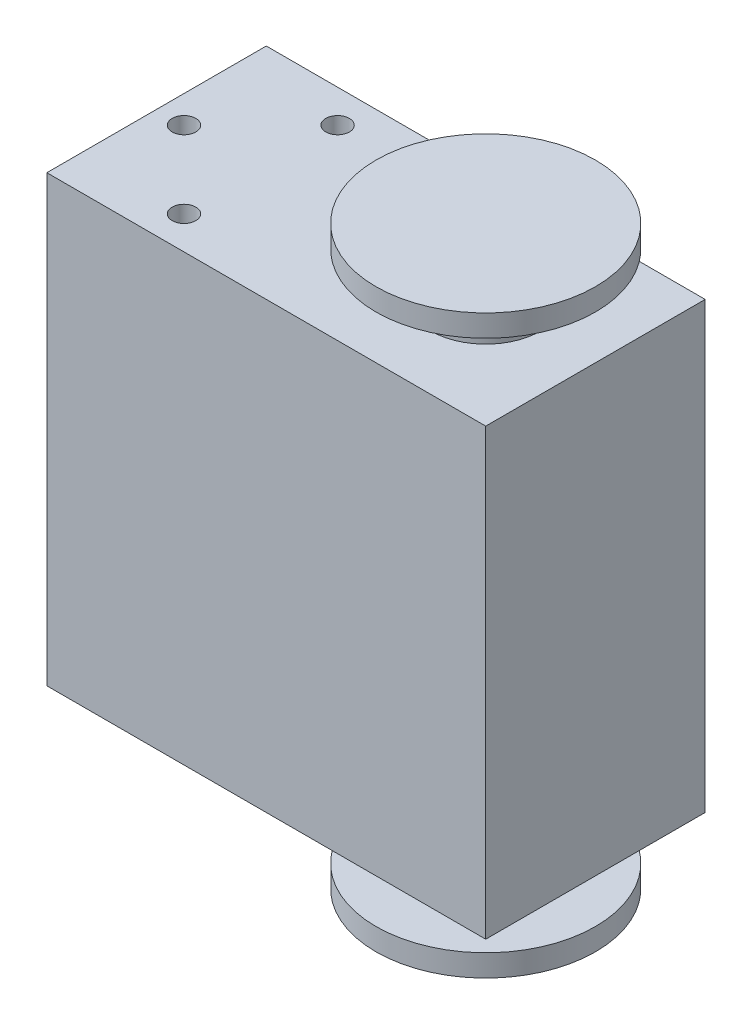
ISO-10303-21;
HEADER;
FILE_DESCRIPTION(('STEP AP214'),'2;1');
FILE_NAME('part.step','',(''),(''),'','','');
FILE_SCHEMA(('AUTOMOTIVE_DESIGN { 1 0 10303 214 1 1 1 1 }'));
ENDSEC;
DATA;
#1=APPLICATION_CONTEXT('core data for automotive mechanical design processes');
#2=APPLICATION_PROTOCOL_DEFINITION('international standard','automotive_design',2000,#1);
#3=PRODUCT_CONTEXT('',#1,'mechanical');
#4=PRODUCT('Part','Part','',(#3));
#5=PRODUCT_RELATED_PRODUCT_CATEGORY('part','',(#4));
#6=PRODUCT_DEFINITION_FORMATION('','',#4);
#7=PRODUCT_DEFINITION_CONTEXT('part definition',#1,'design');
#8=PRODUCT_DEFINITION('design','',#6,#7);
#9=PRODUCT_DEFINITION_SHAPE('','',#8);
#10=(LENGTH_UNIT() NAMED_UNIT(*) SI_UNIT(.MILLI.,.METRE.));
#11=(NAMED_UNIT(*) PLANE_ANGLE_UNIT() SI_UNIT($,.RADIAN.));
#12=(NAMED_UNIT(*) SI_UNIT($,.STERADIAN.) SOLID_ANGLE_UNIT());
#13=UNCERTAINTY_MEASURE_WITH_UNIT(LENGTH_MEASURE(1.E-05),#10,'distance_accuracy_value','');
#14=(GEOMETRIC_REPRESENTATION_CONTEXT(3) GLOBAL_UNCERTAINTY_ASSIGNED_CONTEXT((#13)) GLOBAL_UNIT_ASSIGNED_CONTEXT((#10,
#11,#12)) REPRESENTATION_CONTEXT('',''));
#15=CARTESIAN_POINT('',(0.,0.,0.));
#16=DIRECTION('',(0.,0.,1.));
#17=DIRECTION('',(1.,0.,0.));
#18=AXIS2_PLACEMENT_3D('',#15,#16,#17);
#19=CARTESIAN_POINT('',(0.,0.,20.));
#20=DIRECTION('',(1.,0.,0.));
#21=DIRECTION('',(0.,0.,-1.));
#22=AXIS2_PLACEMENT_3D('',#19,#20,#21);
#23=PLANE('',#22);
#24=DIRECTION('',(0.,-1.,0.));
#25=VECTOR('',#24,1.);
#26=CARTESIAN_POINT('',(0.,0.,0.));
#27=LINE('',#26,#25);
#28=CARTESIAN_POINT('',(0.,40.5,0.));
#29=VERTEX_POINT('',#28);
#30=CARTESIAN_POINT('',(0.,0.,0.));
#31=VERTEX_POINT('',#30);
#32=EDGE_CURVE('E100',#29,#31,#27,.T.);
#33=ORIENTED_EDGE('',*,*,#32,.T.);
#34=DIRECTION('',(0.,0.,-1.));
#35=VECTOR('',#34,1.);
#36=CARTESIAN_POINT('',(0.,0.,20.));
#37=LINE('',#36,#35);
#38=CARTESIAN_POINT('',(0.,0.,20.));
#39=VERTEX_POINT('',#38);
#40=EDGE_CURVE('E11',#39,#31,#37,.T.);
#41=ORIENTED_EDGE('',*,*,#40,.F.);
#42=DIRECTION('',(0.,-1.,0.));
#43=VECTOR('',#42,1.);
#44=CARTESIAN_POINT('',(0.,0.,20.));
#45=LINE('',#44,#43);
#46=CARTESIAN_POINT('',(0.,40.5,20.));
#47=VERTEX_POINT('',#46);
#48=EDGE_CURVE('E85',#47,#39,#45,.T.);
#49=ORIENTED_EDGE('',*,*,#48,.F.);
#50=DIRECTION('',(0.,0.,-1.));
#51=VECTOR('',#50,1.);
#52=CARTESIAN_POINT('',(0.,40.5,20.));
#53=LINE('',#52,#51);
#54=EDGE_CURVE('E96',#47,#29,#53,.T.);
#55=ORIENTED_EDGE('',*,*,#54,.T.);
#56=EDGE_LOOP('',(#33,#41,#49,#55));
#57=FACE_BOUND('',#56,.T.);
#58=ADVANCED_FACE('F37',(#57),#23,.F.);
#59=CARTESIAN_POINT('',(0.,0.,20.));
#60=DIRECTION('',(0.,1.,0.));
#61=DIRECTION('',(0.,0.,1.));
#62=AXIS2_PLACEMENT_3D('',#59,#60,#61);
#63=PLANE('',#62);
#64=CARTESIAN_POINT('',(2.5,0.,2.5));
#65=DIRECTION('',(0.,-1.,0.));
#66=DIRECTION('',(0.,0.,-1.));
#67=AXIS2_PLACEMENT_3D('',#64,#65,#66);
#68=CIRCLE('',#67,1.);
#69=CARTESIAN_POINT('',(2.5,0.,1.5));
#70=VERTEX_POINT('',#69);
#71=EDGE_CURVE('E180',#70,#70,#68,.T.);
#72=ORIENTED_EDGE('',*,*,#71,.F.);
#73=EDGE_LOOP('',(#72));
#74=FACE_BOUND('',#73,.T.);
#75=CARTESIAN_POINT('',(2.5,0.,17.5));
#76=DIRECTION('',(0.,-1.,0.));
#77=DIRECTION('',(0.,0.,-1.));
#78=AXIS2_PLACEMENT_3D('',#75,#76,#77);
#79=CIRCLE('',#78,1.);
#80=CARTESIAN_POINT('',(2.5,0.,16.5));
#81=VERTEX_POINT('',#80);
#82=EDGE_CURVE('E185',#81,#81,#79,.T.);
#83=ORIENTED_EDGE('',*,*,#82,.F.);
#84=EDGE_LOOP('',(#83));
#85=FACE_BOUND('',#84,.T.);
#86=CARTESIAN_POINT('',(17.5,0.,17.5));
#87=DIRECTION('',(0.,-1.,0.));
#88=DIRECTION('',(0.,0.,-1.));
#89=AXIS2_PLACEMENT_3D('',#86,#87,#88);
#90=CIRCLE('',#89,1.);
#91=CARTESIAN_POINT('',(17.5,0.,16.5));
#92=VERTEX_POINT('',#91);
#93=EDGE_CURVE('E191',#92,#92,#90,.T.);
#94=ORIENTED_EDGE('',*,*,#93,.F.);
#95=EDGE_LOOP('',(#94));
#96=FACE_BOUND('',#95,.T.);
#97=CARTESIAN_POINT('',(17.5,0.,2.5));
#98=DIRECTION('',(0.,-1.,0.));
#99=DIRECTION('',(0.,0.,-1.));
#100=AXIS2_PLACEMENT_3D('',#97,#98,#99);
#101=CIRCLE('',#100,1.);
#102=CARTESIAN_POINT('',(17.5,0.,1.5));
#103=VERTEX_POINT('',#102);
#104=EDGE_CURVE('E197',#103,#103,#101,.T.);
#105=ORIENTED_EDGE('',*,*,#104,.F.);
#106=EDGE_LOOP('',(#105));
#107=FACE_BOUND('',#106,.T.);
#108=DIRECTION('',(1.,0.,0.));
#109=VECTOR('',#108,1.);
#110=CARTESIAN_POINT('',(0.,0.,0.));
#111=LINE('',#110,#109);
#112=CARTESIAN_POINT('',(40.,0.,0.));
#113=VERTEX_POINT('',#112);
#114=EDGE_CURVE('E91',#31,#113,#111,.T.);
#115=ORIENTED_EDGE('',*,*,#114,.T.);
#116=DIRECTION('',(0.,0.,-1.));
#117=VECTOR('',#116,1.);
#118=CARTESIAN_POINT('',(40.,0.,20.));
#119=LINE('',#118,#117);
#120=CARTESIAN_POINT('',(40.,0.,20.));
#121=VERTEX_POINT('',#120);
#122=EDGE_CURVE('E45',#121,#113,#119,.T.);
#123=ORIENTED_EDGE('',*,*,#122,.F.);
#124=DIRECTION('',(1.,0.,0.));
#125=VECTOR('',#124,1.);
#126=CARTESIAN_POINT('',(0.,0.,20.));
#127=LINE('',#126,#125);
#128=EDGE_CURVE('E80',#39,#121,#127,.T.);
#129=ORIENTED_EDGE('',*,*,#128,.F.);
#130=ORIENTED_EDGE('',*,*,#40,.T.);
#131=EDGE_LOOP('',(#115,#123,#129,#130));
#132=FACE_BOUND('',#131,.T.);
#133=CARTESIAN_POINT('',(30.,0.,10.));
#134=DIRECTION('',(0.,1.,0.));
#135=DIRECTION('',(0.,0.,1.));
#136=AXIS2_PLACEMENT_3D('',#133,#134,#135);
#137=CIRCLE('',#136,5.);
#138=CARTESIAN_POINT('',(30.,0.,15.));
#139=VERTEX_POINT('',#138);
#140=EDGE_CURVE('E301',#139,#139,#137,.T.);
#141=ORIENTED_EDGE('',*,*,#140,.T.);
#142=EDGE_LOOP('',(#141));
#143=FACE_BOUND('',#142,.T.);
#144=ADVANCED_FACE('F89',(#74,#85,#96,#107,#132,#143),#63,.F.);
#145=CARTESIAN_POINT('',(40.,0.,20.));
#146=DIRECTION('',(-1.,0.,0.));
#147=DIRECTION('',(0.,0.,1.));
#148=AXIS2_PLACEMENT_3D('',#145,#146,#147);
#149=PLANE('',#148);
#150=ORIENTED_EDGE('',*,*,#122,.T.);
#151=DIRECTION('',(0.,1.,0.));
#152=VECTOR('',#151,1.);
#153=CARTESIAN_POINT('',(40.,0.,0.));
#154=LINE('',#153,#152);
#155=CARTESIAN_POINT('',(40.,40.5,0.));
#156=VERTEX_POINT('',#155);
#157=EDGE_CURVE('E105',#113,#156,#154,.T.);
#158=ORIENTED_EDGE('',*,*,#157,.T.);
#159=DIRECTION('',(0.,0.,-1.));
#160=VECTOR('',#159,1.);
#161=CARTESIAN_POINT('',(40.,40.5,20.));
#162=LINE('',#161,#160);
#163=CARTESIAN_POINT('',(40.,40.5,20.));
#164=VERTEX_POINT('',#163);
#165=EDGE_CURVE('E69',#164,#156,#162,.T.);
#166=ORIENTED_EDGE('',*,*,#165,.F.);
#167=DIRECTION('',(0.,1.,0.));
#168=VECTOR('',#167,1.);
#169=CARTESIAN_POINT('',(40.,0.,20.));
#170=LINE('',#169,#168);
#171=EDGE_CURVE('E83',#121,#164,#170,.T.);
#172=ORIENTED_EDGE('',*,*,#171,.F.);
#173=EDGE_LOOP('',(#150,#158,#166,#172));
#174=FACE_BOUND('',#173,.T.);
#175=ADVANCED_FACE('F94',(#174),#149,.F.);
#176=CARTESIAN_POINT('',(0.,40.5,20.));
#177=DIRECTION('',(0.,-1.,0.));
#178=DIRECTION('',(0.,0.,-1.));
#179=AXIS2_PLACEMENT_3D('',#176,#177,#178);
#180=PLANE('',#179);
#181=CARTESIAN_POINT('',(9.5,40.5,3.));
#182=DIRECTION('',(0.,1.,0.));
#183=DIRECTION('',(0.,0.,1.));
#184=AXIS2_PLACEMENT_3D('',#181,#182,#183);
#185=CIRCLE('',#184,1.07617120434425);
#186=CARTESIAN_POINT('',(9.5,40.5,4.07617120434425));
#187=VERTEX_POINT('',#186);
#188=EDGE_CURVE('E144',#187,#187,#185,.T.);
#189=ORIENTED_EDGE('',*,*,#188,.F.);
#190=EDGE_LOOP('',(#189));
#191=FACE_BOUND('',#190,.T.);
#192=CARTESIAN_POINT('',(9.5,40.5,17.));
#193=DIRECTION('',(0.,1.,0.));
#194=DIRECTION('',(0.,0.,1.));
#195=AXIS2_PLACEMENT_3D('',#192,#193,#194);
#196=CIRCLE('',#195,1.07617120434425);
#197=CARTESIAN_POINT('',(9.5,40.5,18.0761712043443));
#198=VERTEX_POINT('',#197);
#199=EDGE_CURVE('E148',#198,#198,#196,.T.);
#200=ORIENTED_EDGE('',*,*,#199,.F.);
#201=EDGE_LOOP('',(#200));
#202=FACE_BOUND('',#201,.T.);
#203=CARTESIAN_POINT('',(2.5,40.5,10.));
#204=DIRECTION('',(0.,1.,0.));
#205=DIRECTION('',(0.,0.,1.));
#206=AXIS2_PLACEMENT_3D('',#203,#204,#205);
#207=CIRCLE('',#206,1.07617120434425);
#208=CARTESIAN_POINT('',(2.5,40.5,11.0761712043443));
#209=VERTEX_POINT('',#208);
#210=EDGE_CURVE('E151',#209,#209,#207,.T.);
#211=ORIENTED_EDGE('',*,*,#210,.F.);
#212=EDGE_LOOP('',(#211));
#213=FACE_BOUND('',#212,.T.);
#214=ORIENTED_EDGE('',*,*,#54,.F.);
#215=DIRECTION('',(-1.,0.,0.));
#216=VECTOR('',#215,1.);
#217=CARTESIAN_POINT('',(0.,40.5,20.));
#218=LINE('',#217,#216);
#219=EDGE_CURVE('E53',#164,#47,#218,.T.);
#220=ORIENTED_EDGE('',*,*,#219,.F.);
#221=ORIENTED_EDGE('',*,*,#165,.T.);
#222=DIRECTION('',(-1.,0.,0.));
#223=VECTOR('',#222,1.);
#224=CARTESIAN_POINT('',(0.,40.5,0.));
#225=LINE('',#224,#223);
#226=EDGE_CURVE('E73',#156,#29,#225,.T.);
#227=ORIENTED_EDGE('',*,*,#226,.T.);
#228=EDGE_LOOP('',(#214,#220,#221,#227));
#229=FACE_BOUND('',#228,.T.);
#230=CARTESIAN_POINT('',(30.,40.5,10.));
#231=DIRECTION('',(0.,1.,0.));
#232=DIRECTION('',(0.,0.,1.));
#233=AXIS2_PLACEMENT_3D('',#230,#231,#232);
#234=CIRCLE('',#233,5.);
#235=CARTESIAN_POINT('',(30.,40.5,15.));
#236=VERTEX_POINT('',#235);
#237=EDGE_CURVE('E155',#236,#236,#234,.T.);
#238=ORIENTED_EDGE('',*,*,#237,.F.);
#239=EDGE_LOOP('',(#238));
#240=FACE_BOUND('',#239,.T.);
#241=ADVANCED_FACE('F123',(#191,#202,#213,#229,#240),#180,.F.);
#242=CARTESIAN_POINT('',(0.,0.,20.));
#243=DIRECTION('',(0.,0.,-1.));
#244=DIRECTION('',(-1.,0.,0.));
#245=AXIS2_PLACEMENT_3D('',#242,#243,#244);
#246=PLANE('',#245);
#247=ORIENTED_EDGE('',*,*,#128,.T.);
#248=ORIENTED_EDGE('',*,*,#171,.T.);
#249=ORIENTED_EDGE('',*,*,#219,.T.);
#250=ORIENTED_EDGE('',*,*,#48,.T.);
#251=EDGE_LOOP('',(#247,#248,#249,#250));
#252=FACE_BOUND('',#251,.T.);
#253=ADVANCED_FACE('F81',(#252),#246,.F.);
#254=CARTESIAN_POINT('',(0.,0.,0.));
#255=DIRECTION('',(0.,0.,-1.));
#256=DIRECTION('',(-1.,0.,0.));
#257=AXIS2_PLACEMENT_3D('',#254,#255,#256);
#258=PLANE('',#257);
#259=ORIENTED_EDGE('',*,*,#32,.F.);
#260=ORIENTED_EDGE('',*,*,#226,.F.);
#261=ORIENTED_EDGE('',*,*,#157,.F.);
#262=ORIENTED_EDGE('',*,*,#114,.F.);
#263=EDGE_LOOP('',(#259,#260,#261,#262));
#264=FACE_BOUND('',#263,.T.);
#265=ADVANCED_FACE('F112',(#264),#258,.T.);
#266=CARTESIAN_POINT('',(17.5,5.,2.5));
#267=DIRECTION('',(0.,-1.,0.));
#268=DIRECTION('',(0.,0.,-1.));
#269=AXIS2_PLACEMENT_3D('',#266,#267,#268);
#270=CYLINDRICAL_SURFACE('',#269,1.);
#271=CARTESIAN_POINT('',(17.5,5.,2.5));
#272=DIRECTION('',(0.,-1.,0.));
#273=DIRECTION('',(0.,0.,-1.));
#274=AXIS2_PLACEMENT_3D('',#271,#272,#273);
#275=CIRCLE('',#274,1.);
#276=CARTESIAN_POINT('',(17.5,5.,1.5));
#277=VERTEX_POINT('',#276);
#278=EDGE_CURVE('E200',#277,#277,#275,.T.);
#279=ORIENTED_EDGE('',*,*,#278,.F.);
#280=EDGE_LOOP('',(#279));
#281=FACE_BOUND('',#280,.T.);
#282=ORIENTED_EDGE('',*,*,#104,.T.);
#283=EDGE_LOOP('',(#282));
#284=FACE_BOUND('',#283,.T.);
#285=ADVANCED_FACE('F114',(#281,#284),#270,.F.);
#286=CARTESIAN_POINT('',(17.5,5.,2.5));
#287=DIRECTION('',(0.,-1.,0.));
#288=DIRECTION('',(0.,0.,-1.));
#289=AXIS2_PLACEMENT_3D('',#286,#287,#288);
#290=PLANE('',#289);
#291=ORIENTED_EDGE('',*,*,#278,.T.);
#292=EDGE_LOOP('',(#291));
#293=FACE_BOUND('',#292,.T.);
#294=ADVANCED_FACE('F120',(#293),#290,.T.);
#295=CARTESIAN_POINT('',(17.5,5.,17.5));
#296=DIRECTION('',(0.,-1.,0.));
#297=DIRECTION('',(0.,0.,-1.));
#298=AXIS2_PLACEMENT_3D('',#295,#296,#297);
#299=CYLINDRICAL_SURFACE('',#298,1.);
#300=CARTESIAN_POINT('',(17.5,5.,17.5));
#301=DIRECTION('',(0.,-1.,0.));
#302=DIRECTION('',(0.,0.,-1.));
#303=AXIS2_PLACEMENT_3D('',#300,#301,#302);
#304=CIRCLE('',#303,1.);
#305=CARTESIAN_POINT('',(17.5,5.,16.5));
#306=VERTEX_POINT('',#305);
#307=EDGE_CURVE('E194',#306,#306,#304,.T.);
#308=ORIENTED_EDGE('',*,*,#307,.F.);
#309=EDGE_LOOP('',(#308));
#310=FACE_BOUND('',#309,.T.);
#311=ORIENTED_EDGE('',*,*,#93,.T.);
#312=EDGE_LOOP('',(#311));
#313=FACE_BOUND('',#312,.T.);
#314=ADVANCED_FACE('F235',(#310,#313),#299,.F.);
#315=CARTESIAN_POINT('',(17.5,5.,17.5));
#316=DIRECTION('',(0.,-1.,0.));
#317=DIRECTION('',(0.,0.,-1.));
#318=AXIS2_PLACEMENT_3D('',#315,#316,#317);
#319=PLANE('',#318);
#320=ORIENTED_EDGE('',*,*,#307,.T.);
#321=EDGE_LOOP('',(#320));
#322=FACE_BOUND('',#321,.T.);
#323=ADVANCED_FACE('F239',(#322),#319,.T.);
#324=CARTESIAN_POINT('',(2.5,5.,17.5));
#325=DIRECTION('',(0.,-1.,0.));
#326=DIRECTION('',(0.,0.,-1.));
#327=AXIS2_PLACEMENT_3D('',#324,#325,#326);
#328=CYLINDRICAL_SURFACE('',#327,1.);
#329=CARTESIAN_POINT('',(2.5,5.,17.5));
#330=DIRECTION('',(0.,-1.,0.));
#331=DIRECTION('',(0.,0.,-1.));
#332=AXIS2_PLACEMENT_3D('',#329,#330,#331);
#333=CIRCLE('',#332,1.);
#334=CARTESIAN_POINT('',(2.5,5.,16.5));
#335=VERTEX_POINT('',#334);
#336=EDGE_CURVE('E188',#335,#335,#333,.T.);
#337=ORIENTED_EDGE('',*,*,#336,.F.);
#338=EDGE_LOOP('',(#337));
#339=FACE_BOUND('',#338,.T.);
#340=ORIENTED_EDGE('',*,*,#82,.T.);
#341=EDGE_LOOP('',(#340));
#342=FACE_BOUND('',#341,.T.);
#343=ADVANCED_FACE('F243',(#339,#342),#328,.F.);
#344=CARTESIAN_POINT('',(2.5,5.,17.5));
#345=DIRECTION('',(0.,-1.,0.));
#346=DIRECTION('',(0.,0.,-1.));
#347=AXIS2_PLACEMENT_3D('',#344,#345,#346);
#348=PLANE('',#347);
#349=ORIENTED_EDGE('',*,*,#336,.T.);
#350=EDGE_LOOP('',(#349));
#351=FACE_BOUND('',#350,.T.);
#352=ADVANCED_FACE('F247',(#351),#348,.T.);
#353=CARTESIAN_POINT('',(2.5,5.,2.5));
#354=DIRECTION('',(0.,-1.,0.));
#355=DIRECTION('',(0.,0.,-1.));
#356=AXIS2_PLACEMENT_3D('',#353,#354,#355);
#357=CYLINDRICAL_SURFACE('',#356,1.);
#358=CARTESIAN_POINT('',(2.5,5.,2.5));
#359=DIRECTION('',(0.,-1.,0.));
#360=DIRECTION('',(0.,0.,-1.));
#361=AXIS2_PLACEMENT_3D('',#358,#359,#360);
#362=CIRCLE('',#361,1.);
#363=CARTESIAN_POINT('',(2.5,5.,1.5));
#364=VERTEX_POINT('',#363);
#365=EDGE_CURVE('E182',#364,#364,#362,.T.);
#366=ORIENTED_EDGE('',*,*,#365,.F.);
#367=EDGE_LOOP('',(#366));
#368=FACE_BOUND('',#367,.T.);
#369=ORIENTED_EDGE('',*,*,#71,.T.);
#370=EDGE_LOOP('',(#369));
#371=FACE_BOUND('',#370,.T.);
#372=ADVANCED_FACE('F251',(#368,#371),#357,.F.);
#373=CARTESIAN_POINT('',(2.5,5.,2.5));
#374=DIRECTION('',(0.,-1.,0.));
#375=DIRECTION('',(0.,0.,-1.));
#376=AXIS2_PLACEMENT_3D('',#373,#374,#375);
#377=PLANE('',#376);
#378=ORIENTED_EDGE('',*,*,#365,.T.);
#379=EDGE_LOOP('',(#378));
#380=FACE_BOUND('',#379,.T.);
#381=ADVANCED_FACE('F255',(#380),#377,.T.);
#382=CARTESIAN_POINT('',(2.5,35.5,10.));
#383=DIRECTION('',(0.,1.,0.));
#384=DIRECTION('',(0.,0.,1.));
#385=AXIS2_PLACEMENT_3D('',#382,#383,#384);
#386=CYLINDRICAL_SURFACE('',#385,1.07617120434425);
#387=CARTESIAN_POINT('',(2.5,35.5,10.));
#388=DIRECTION('',(0.,1.,0.));
#389=DIRECTION('',(0.,0.,1.));
#390=AXIS2_PLACEMENT_3D('',#387,#388,#389);
#391=CIRCLE('',#390,1.07617120434425);
#392=CARTESIAN_POINT('',(2.5,35.5,11.0761712043443));
#393=VERTEX_POINT('',#392);
#394=EDGE_CURVE('E177',#393,#393,#391,.T.);
#395=ORIENTED_EDGE('',*,*,#394,.F.);
#396=EDGE_LOOP('',(#395));
#397=FACE_BOUND('',#396,.T.);
#398=ORIENTED_EDGE('',*,*,#210,.T.);
#399=EDGE_LOOP('',(#398));
#400=FACE_BOUND('',#399,.T.);
#401=ADVANCED_FACE('F259',(#397,#400),#386,.F.);
#402=CARTESIAN_POINT('',(2.5,35.5,10.));
#403=DIRECTION('',(0.,1.,0.));
#404=DIRECTION('',(0.,0.,1.));
#405=AXIS2_PLACEMENT_3D('',#402,#403,#404);
#406=PLANE('',#405);
#407=ORIENTED_EDGE('',*,*,#394,.T.);
#408=EDGE_LOOP('',(#407));
#409=FACE_BOUND('',#408,.T.);
#410=ADVANCED_FACE('F263',(#409),#406,.T.);
#411=CARTESIAN_POINT('',(9.5,35.5,17.));
#412=DIRECTION('',(0.,1.,0.));
#413=DIRECTION('',(0.,0.,1.));
#414=AXIS2_PLACEMENT_3D('',#411,#412,#413);
#415=CYLINDRICAL_SURFACE('',#414,1.07617120434425);
#416=CARTESIAN_POINT('',(9.5,35.5,17.));
#417=DIRECTION('',(0.,1.,0.));
#418=DIRECTION('',(0.,0.,1.));
#419=AXIS2_PLACEMENT_3D('',#416,#417,#418);
#420=CIRCLE('',#419,1.07617120434425);
#421=CARTESIAN_POINT('',(9.5,35.5,18.0761712043443));
#422=VERTEX_POINT('',#421);
#423=EDGE_CURVE('E173',#422,#422,#420,.T.);
#424=ORIENTED_EDGE('',*,*,#423,.F.);
#425=EDGE_LOOP('',(#424));
#426=FACE_BOUND('',#425,.T.);
#427=ORIENTED_EDGE('',*,*,#199,.T.);
#428=EDGE_LOOP('',(#427));
#429=FACE_BOUND('',#428,.T.);
#430=ADVANCED_FACE('F267',(#426,#429),#415,.F.);
#431=CARTESIAN_POINT('',(9.5,35.5,17.));
#432=DIRECTION('',(0.,1.,0.));
#433=DIRECTION('',(0.,0.,1.));
#434=AXIS2_PLACEMENT_3D('',#431,#432,#433);
#435=PLANE('',#434);
#436=ORIENTED_EDGE('',*,*,#423,.T.);
#437=EDGE_LOOP('',(#436));
#438=FACE_BOUND('',#437,.T.);
#439=ADVANCED_FACE('F271',(#438),#435,.T.);
#440=CARTESIAN_POINT('',(9.5,35.5,3.));
#441=DIRECTION('',(0.,1.,0.));
#442=DIRECTION('',(0.,0.,1.));
#443=AXIS2_PLACEMENT_3D('',#440,#441,#442);
#444=CYLINDRICAL_SURFACE('',#443,1.07617120434425);
#445=CARTESIAN_POINT('',(9.5,35.5,3.));
#446=DIRECTION('',(0.,1.,0.));
#447=DIRECTION('',(0.,0.,1.));
#448=AXIS2_PLACEMENT_3D('',#445,#446,#447);
#449=CIRCLE('',#448,1.07617120434425);
#450=CARTESIAN_POINT('',(9.5,35.5,4.07617120434425));
#451=VERTEX_POINT('',#450);
#452=EDGE_CURVE('E169',#451,#451,#449,.T.);
#453=ORIENTED_EDGE('',*,*,#452,.F.);
#454=EDGE_LOOP('',(#453));
#455=FACE_BOUND('',#454,.T.);
#456=ORIENTED_EDGE('',*,*,#188,.T.);
#457=EDGE_LOOP('',(#456));
#458=FACE_BOUND('',#457,.T.);
#459=ADVANCED_FACE('F275',(#455,#458),#444,.F.);
#460=CARTESIAN_POINT('',(9.5,35.5,3.));
#461=DIRECTION('',(0.,1.,0.));
#462=DIRECTION('',(0.,0.,1.));
#463=AXIS2_PLACEMENT_3D('',#460,#461,#462);
#464=PLANE('',#463);
#465=ORIENTED_EDGE('',*,*,#452,.T.);
#466=EDGE_LOOP('',(#465));
#467=FACE_BOUND('',#466,.T.);
#468=ADVANCED_FACE('F279',(#467),#464,.T.);
#469=CARTESIAN_POINT('',(30.,44.5,10.));
#470=DIRECTION('',(0.,1.,0.));
#471=DIRECTION('',(0.,0.,1.));
#472=AXIS2_PLACEMENT_3D('',#469,#470,#471);
#473=PLANE('',#472);
#474=CARTESIAN_POINT('',(30.,44.5,10.));
#475=DIRECTION('',(0.,1.,0.));
#476=DIRECTION('',(0.,0.,1.));
#477=AXIS2_PLACEMENT_3D('',#474,#475,#476);
#478=CIRCLE('',#477,10.);
#479=CARTESIAN_POINT('',(30.,44.5,20.));
#480=VERTEX_POINT('',#479);
#481=EDGE_CURVE('E161',#480,#480,#478,.T.);
#482=ORIENTED_EDGE('',*,*,#481,.F.);
#483=EDGE_LOOP('',(#482));
#484=FACE_BOUND('',#483,.T.);
#485=CARTESIAN_POINT('',(30.,44.5,10.));
#486=DIRECTION('',(0.,1.,0.));
#487=DIRECTION('',(0.,0.,1.));
#488=AXIS2_PLACEMENT_3D('',#485,#486,#487);
#489=CIRCLE('',#488,5.);
#490=CARTESIAN_POINT('',(30.,44.5,15.));
#491=VERTEX_POINT('',#490);
#492=EDGE_CURVE('E157',#491,#491,#489,.T.);
#493=ORIENTED_EDGE('',*,*,#492,.T.);
#494=EDGE_LOOP('',(#493));
#495=FACE_BOUND('',#494,.T.);
#496=ADVANCED_FACE('F283',(#484,#495),#473,.F.);
#497=CARTESIAN_POINT('',(30.,44.5,10.));
#498=DIRECTION('',(0.,-1.,0.));
#499=DIRECTION('',(0.,0.,-1.));
#500=AXIS2_PLACEMENT_3D('',#497,#498,#499);
#501=CYLINDRICAL_SURFACE('',#500,5.);
#502=ORIENTED_EDGE('',*,*,#492,.F.);
#503=EDGE_LOOP('',(#502));
#504=FACE_BOUND('',#503,.T.);
#505=ORIENTED_EDGE('',*,*,#237,.T.);
#506=EDGE_LOOP('',(#505));
#507=FACE_BOUND('',#506,.T.);
#508=ADVANCED_FACE('F230',(#504,#507),#501,.T.);
#509=CARTESIAN_POINT('',(30.,46.5,10.));
#510=DIRECTION('',(0.,1.,0.));
#511=DIRECTION('',(0.,0.,1.));
#512=AXIS2_PLACEMENT_3D('',#509,#510,#511);
#513=PLANE('',#512);
#514=CARTESIAN_POINT('',(30.,46.5,10.));
#515=DIRECTION('',(0.,1.,0.));
#516=DIRECTION('',(0.,0.,1.));
#517=AXIS2_PLACEMENT_3D('',#514,#515,#516);
#518=CIRCLE('',#517,10.);
#519=CARTESIAN_POINT('',(30.,46.5,20.));
#520=VERTEX_POINT('',#519);
#521=EDGE_CURVE('E203',#520,#520,#518,.T.);
#522=ORIENTED_EDGE('',*,*,#521,.T.);
#523=EDGE_LOOP('',(#522));
#524=FACE_BOUND('',#523,.T.);
#525=ADVANCED_FACE('F228',(#524),#513,.T.);
#526=CARTESIAN_POINT('',(30.,-6.,10.));
#527=DIRECTION('',(0.,1.,0.));
#528=DIRECTION('',(0.,0.,1.));
#529=AXIS2_PLACEMENT_3D('',#526,#527,#528);
#530=CYLINDRICAL_SURFACE('',#529,10.);
#531=CARTESIAN_POINT('',(30.,44.5,20.));
#532=CARTESIAN_POINT('',(30.,44.5208333333333,20.));
#533=CARTESIAN_POINT('',(30.,44.5416666666667,20.));
#534=CARTESIAN_POINT('',(30.,44.5833333333333,20.));
#535=CARTESIAN_POINT('',(30.,44.6041666666667,20.));
#536=CARTESIAN_POINT('',(30.,44.6458333333333,20.));
#537=CARTESIAN_POINT('',(30.,44.6666666666667,20.));
#538=CARTESIAN_POINT('',(30.,44.7083333333333,20.));
#539=CARTESIAN_POINT('',(30.,44.7291666666667,20.));
#540=CARTESIAN_POINT('',(30.,44.7708333333333,20.));
#541=CARTESIAN_POINT('',(30.,44.7916666666667,20.));
#542=CARTESIAN_POINT('',(30.,44.8333333333333,20.));
#543=CARTESIAN_POINT('',(30.,44.8541666666667,20.));
#544=CARTESIAN_POINT('',(30.,44.8958333333333,20.));
#545=CARTESIAN_POINT('',(30.,44.9166666666667,20.));
#546=CARTESIAN_POINT('',(30.,44.9583333333333,20.));
#547=CARTESIAN_POINT('',(30.,44.9791666666667,20.));
#548=CARTESIAN_POINT('',(30.,45.0208333333333,20.));
#549=CARTESIAN_POINT('',(30.,45.0416666666667,20.));
#550=CARTESIAN_POINT('',(30.,45.0833333333333,20.));
#551=CARTESIAN_POINT('',(30.,45.1041666666667,20.));
#552=CARTESIAN_POINT('',(30.,45.1458333333333,20.));
#553=CARTESIAN_POINT('',(30.,45.1666666666667,20.));
#554=CARTESIAN_POINT('',(30.,45.2083333333333,20.));
#555=CARTESIAN_POINT('',(30.,45.2291666666667,20.));
#556=CARTESIAN_POINT('',(30.,45.2708333333333,20.));
#557=CARTESIAN_POINT('',(30.,45.2916666666667,20.));
#558=CARTESIAN_POINT('',(30.,45.3333333333333,20.));
#559=CARTESIAN_POINT('',(30.,45.3541666666667,20.));
#560=CARTESIAN_POINT('',(30.,45.3958333333333,20.));
#561=CARTESIAN_POINT('',(30.,45.4166666666667,20.));
#562=CARTESIAN_POINT('',(30.,45.4583333333333,20.));
#563=CARTESIAN_POINT('',(30.,45.4791666666667,20.));
#564=CARTESIAN_POINT('',(30.,45.5208333333333,20.));
#565=CARTESIAN_POINT('',(30.,45.5416666666667,20.));
#566=CARTESIAN_POINT('',(30.,45.5833333333333,20.));
#567=CARTESIAN_POINT('',(30.,45.6041666666667,20.));
#568=CARTESIAN_POINT('',(30.,45.6458333333333,20.));
#569=CARTESIAN_POINT('',(30.,45.6666666666667,20.));
#570=CARTESIAN_POINT('',(30.,45.7083333333333,20.));
#571=CARTESIAN_POINT('',(30.,45.7291666666667,20.));
#572=CARTESIAN_POINT('',(30.,45.7708333333333,20.));
#573=CARTESIAN_POINT('',(30.,45.7916666666667,20.));
#574=CARTESIAN_POINT('',(30.,45.8333333333333,20.));
#575=CARTESIAN_POINT('',(30.,45.8541666666667,20.));
#576=CARTESIAN_POINT('',(30.,45.8958333333333,20.));
#577=CARTESIAN_POINT('',(30.,45.9166666666667,20.));
#578=CARTESIAN_POINT('',(30.,45.9583333333333,20.));
#579=CARTESIAN_POINT('',(30.,45.9791666666667,20.));
#580=CARTESIAN_POINT('',(30.,46.0208333333333,20.));
#581=CARTESIAN_POINT('',(30.,46.0416666666667,20.));
#582=CARTESIAN_POINT('',(30.,46.0833333333333,20.));
#583=CARTESIAN_POINT('',(30.,46.1041666666667,20.));
#584=CARTESIAN_POINT('',(30.,46.1458333333333,20.));
#585=CARTESIAN_POINT('',(30.,46.1666666666667,20.));
#586=CARTESIAN_POINT('',(30.,46.2083333333333,20.));
#587=CARTESIAN_POINT('',(30.,46.2291666666667,20.));
#588=CARTESIAN_POINT('',(30.,46.2708333333333,20.));
#589=CARTESIAN_POINT('',(30.,46.2916666666667,20.));
#590=CARTESIAN_POINT('',(30.,46.3333333333333,20.));
#591=CARTESIAN_POINT('',(30.,46.3541666666667,20.));
#592=CARTESIAN_POINT('',(30.,46.3958333333333,20.));
#593=CARTESIAN_POINT('',(30.,46.4166666666667,20.));
#594=CARTESIAN_POINT('',(30.,46.4583333333333,20.));
#595=CARTESIAN_POINT('',(30.,46.4791666666667,20.));
#596=CARTESIAN_POINT('',(30.,46.5,20.));
#597=B_SPLINE_CURVE_WITH_KNOTS('',3,(#531,#532,#533,#534,#535,#536,#537,#538,#539,#540,#541,
#542,#543,#544,#545,#546,#547,#548,#549,#550,#551,#552,#553,#554,#555,#556,#557,#558,#559,#560,
#561,#562,#563,#564,#565,#566,#567,#568,#569,#570,#571,#572,#573,#574,#575,#576,#577,#578,#579,
#580,#581,#582,#583,#584,#585,#586,#587,#588,#589,#590,#591,#592,#593,#594,#595,#596),
.UNSPECIFIED.,.F.,.F.,(4,2,2,2,2,2,2,2,2,2,2,2,2,2,2,2,2,2,2,2,2,2,2,2,2,2,2,2,2,2,2,2,4),(0.,
0.0625000000000001,0.125,0.1875,0.25,0.3125,0.375,0.4375,0.5,0.5625,0.625000000000001,
0.687500000000001,0.750000000000001,0.812500000000001,0.875000000000001,0.937500000000001,1.,
1.0625,1.125,1.1875,1.25,1.3125,1.375,1.4375,1.5,1.5625,1.625,1.6875,1.75,1.8125,1.875,1.9375,
2.),.UNSPECIFIED.);
#598=EDGE_CURVE('BSEAM223',#480,#520,#597,.T.);
#599=ORIENTED_EDGE('',*,*,#481,.T.);
#600=ORIENTED_EDGE('',*,*,#521,.F.);
#601=ORIENTED_EDGE('',*,*,#598,.T.);
#602=ORIENTED_EDGE('',*,*,#598,.F.);
#603=EDGE_LOOP('',(#599,#601,#600,#602));
#604=FACE_BOUND('',#603,.T.);
#605=ADVANCED_FACE('F223',(#604),#530,.T.);
#606=CARTESIAN_POINT('',(30.,-4.,10.));
#607=DIRECTION('',(0.,-1.,0.));
#608=DIRECTION('',(0.,0.,1.));
#609=AXIS2_PLACEMENT_3D('',#606,#607,#608);
#610=PLANE('',#609);
#611=CARTESIAN_POINT('',(30.,-4.,10.));
#612=DIRECTION('',(0.,1.,0.));
#613=DIRECTION('',(0.,0.,1.));
#614=AXIS2_PLACEMENT_3D('',#611,#612,#613);
#615=CIRCLE('',#614,5.);
#616=CARTESIAN_POINT('',(30.,-4.,15.));
#617=VERTEX_POINT('',#616);
#618=EDGE_CURVE('E164',#617,#617,#615,.T.);
#619=ORIENTED_EDGE('',*,*,#618,.F.);
#620=EDGE_LOOP('',(#619));
#621=FACE_BOUND('',#620,.T.);
#622=CARTESIAN_POINT('',(30.,-4.,10.));
#623=DIRECTION('',(0.,1.,0.));
#624=DIRECTION('',(0.,0.,1.));
#625=AXIS2_PLACEMENT_3D('',#622,#623,#624);
#626=CIRCLE('',#625,10.);
#627=CARTESIAN_POINT('',(30.,-4.,20.));
#628=VERTEX_POINT('',#627);
#629=EDGE_CURVE('E158',#628,#628,#626,.T.);
#630=ORIENTED_EDGE('',*,*,#629,.T.);
#631=EDGE_LOOP('',(#630));
#632=FACE_BOUND('',#631,.T.);
#633=ADVANCED_FACE('F224',(#621,#632),#610,.F.);
#634=CARTESIAN_POINT('',(30.,-4.,10.));
#635=DIRECTION('',(0.,1.,0.));
#636=DIRECTION('',(0.,0.,1.));
#637=AXIS2_PLACEMENT_3D('',#634,#635,#636);
#638=CYLINDRICAL_SURFACE('',#637,5.);
#639=ORIENTED_EDGE('',*,*,#618,.T.);
#640=EDGE_LOOP('',(#639));
#641=FACE_BOUND('',#640,.T.);
#642=ORIENTED_EDGE('',*,*,#140,.F.);
#643=EDGE_LOOP('',(#642));
#644=FACE_BOUND('',#643,.T.);
#645=ADVANCED_FACE('F215',(#641,#644),#638,.T.);
#646=CARTESIAN_POINT('',(30.,-6.,10.));
#647=DIRECTION('',(0.,1.,0.));
#648=DIRECTION('',(0.,0.,1.));
#649=AXIS2_PLACEMENT_3D('',#646,#647,#648);
#650=PLANE('',#649);
#651=CARTESIAN_POINT('',(30.,-6.,10.));
#652=DIRECTION('',(0.,1.,0.));
#653=DIRECTION('',(0.,0.,1.));
#654=AXIS2_PLACEMENT_3D('',#651,#652,#653);
#655=CIRCLE('',#654,10.);
#656=CARTESIAN_POINT('',(30.,-6.,20.));
#657=VERTEX_POINT('',#656);
#658=EDGE_CURVE('E103',#657,#657,#655,.T.);
#659=ORIENTED_EDGE('',*,*,#658,.F.);
#660=EDGE_LOOP('',(#659));
#661=FACE_BOUND('',#660,.T.);
#662=ADVANCED_FACE('F213',(#661),#650,.F.);
#663=CARTESIAN_POINT('',(30.,-4.,20.));
#664=CARTESIAN_POINT('',(30.,-4.02083333333333,20.));
#665=CARTESIAN_POINT('',(30.,-4.04166666666667,20.));
#666=CARTESIAN_POINT('',(30.,-4.08333333333333,20.));
#667=CARTESIAN_POINT('',(30.,-4.10416666666667,20.));
#668=CARTESIAN_POINT('',(30.,-4.14583333333333,20.));
#669=CARTESIAN_POINT('',(30.,-4.16666666666667,20.));
#670=CARTESIAN_POINT('',(30.,-4.20833333333333,20.));
#671=CARTESIAN_POINT('',(30.,-4.22916666666667,20.));
#672=CARTESIAN_POINT('',(30.,-4.27083333333333,20.));
#673=CARTESIAN_POINT('',(30.,-4.29166666666667,20.));
#674=CARTESIAN_POINT('',(30.,-4.33333333333333,20.));
#675=CARTESIAN_POINT('',(30.,-4.35416666666667,20.));
#676=CARTESIAN_POINT('',(30.,-4.39583333333333,20.));
#677=CARTESIAN_POINT('',(30.,-4.41666666666667,20.));
#678=CARTESIAN_POINT('',(30.,-4.45833333333333,20.));
#679=CARTESIAN_POINT('',(30.,-4.47916666666667,20.));
#680=CARTESIAN_POINT('',(30.,-4.52083333333333,20.));
#681=CARTESIAN_POINT('',(30.,-4.54166666666667,20.));
#682=CARTESIAN_POINT('',(30.,-4.58333333333333,20.));
#683=CARTESIAN_POINT('',(30.,-4.60416666666667,20.));
#684=CARTESIAN_POINT('',(30.,-4.64583333333333,20.));
#685=CARTESIAN_POINT('',(30.,-4.66666666666667,20.));
#686=CARTESIAN_POINT('',(30.,-4.70833333333333,20.));
#687=CARTESIAN_POINT('',(30.,-4.72916666666667,20.));
#688=CARTESIAN_POINT('',(30.,-4.77083333333333,20.));
#689=CARTESIAN_POINT('',(30.,-4.79166666666667,20.));
#690=CARTESIAN_POINT('',(30.,-4.83333333333333,20.));
#691=CARTESIAN_POINT('',(30.,-4.85416666666667,20.));
#692=CARTESIAN_POINT('',(30.,-4.89583333333333,20.));
#693=CARTESIAN_POINT('',(30.,-4.91666666666667,20.));
#694=CARTESIAN_POINT('',(30.,-4.95833333333333,20.));
#695=CARTESIAN_POINT('',(30.,-4.97916666666667,20.));
#696=CARTESIAN_POINT('',(30.,-5.02083333333333,20.));
#697=CARTESIAN_POINT('',(30.,-5.04166666666667,20.));
#698=CARTESIAN_POINT('',(30.,-5.08333333333333,20.));
#699=CARTESIAN_POINT('',(30.,-5.10416666666667,20.));
#700=CARTESIAN_POINT('',(30.,-5.14583333333333,20.));
#701=CARTESIAN_POINT('',(30.,-5.16666666666667,20.));
#702=CARTESIAN_POINT('',(30.,-5.20833333333333,20.));
#703=CARTESIAN_POINT('',(30.,-5.22916666666667,20.));
#704=CARTESIAN_POINT('',(30.,-5.27083333333333,20.));
#705=CARTESIAN_POINT('',(30.,-5.29166666666667,20.));
#706=CARTESIAN_POINT('',(30.,-5.33333333333333,20.));
#707=CARTESIAN_POINT('',(30.,-5.35416666666667,20.));
#708=CARTESIAN_POINT('',(30.,-5.39583333333333,20.));
#709=CARTESIAN_POINT('',(30.,-5.41666666666667,20.));
#710=CARTESIAN_POINT('',(30.,-5.45833333333333,20.));
#711=CARTESIAN_POINT('',(30.,-5.47916666666667,20.));
#712=CARTESIAN_POINT('',(30.,-5.52083333333333,20.));
#713=CARTESIAN_POINT('',(30.,-5.54166666666667,20.));
#714=CARTESIAN_POINT('',(30.,-5.58333333333333,20.));
#715=CARTESIAN_POINT('',(30.,-5.60416666666667,20.));
#716=CARTESIAN_POINT('',(30.,-5.64583333333333,20.));
#717=CARTESIAN_POINT('',(30.,-5.66666666666667,20.));
#718=CARTESIAN_POINT('',(30.,-5.70833333333333,20.));
#719=CARTESIAN_POINT('',(30.,-5.72916666666667,20.));
#720=CARTESIAN_POINT('',(30.,-5.77083333333333,20.));
#721=CARTESIAN_POINT('',(30.,-5.79166666666667,20.));
#722=CARTESIAN_POINT('',(30.,-5.83333333333333,20.));
#723=CARTESIAN_POINT('',(30.,-5.85416666666667,20.));
#724=CARTESIAN_POINT('',(30.,-5.89583333333333,20.));
#725=CARTESIAN_POINT('',(30.,-5.91666666666667,20.));
#726=CARTESIAN_POINT('',(30.,-5.95833333333333,20.));
#727=CARTESIAN_POINT('',(30.,-5.97916666666667,20.));
#728=CARTESIAN_POINT('',(30.,-6.,20.));
#729=B_SPLINE_CURVE_WITH_KNOTS('',3,(#663,#664,#665,#666,#667,#668,#669,#670,#671,#672,#673,
#674,#675,#676,#677,#678,#679,#680,#681,#682,#683,#684,#685,#686,#687,#688,#689,#690,#691,#692,
#693,#694,#695,#696,#697,#698,#699,#700,#701,#702,#703,#704,#705,#706,#707,#708,#709,#710,#711,
#712,#713,#714,#715,#716,#717,#718,#719,#720,#721,#722,#723,#724,#725,#726,#727,#728),
.UNSPECIFIED.,.F.,.F.,(4,2,2,2,2,2,2,2,2,2,2,2,2,2,2,2,2,2,2,2,2,2,2,2,2,2,2,2,2,2,2,2,4),(0.,
0.0625000000000001,0.125,0.1875,0.25,0.3125,0.375,0.4375,0.5,0.5625,0.625,0.6875,0.75,0.8125,
0.875,0.9375,0.999999999999999,1.0625,1.125,1.1875,1.25,1.3125,1.375,1.4375,1.5,1.5625,1.625,
1.6875,1.75,1.8125,1.875,1.9375,2.),.UNSPECIFIED.);
#730=EDGE_CURVE('BSEAM211',#628,#657,#729,.T.);
#731=ORIENTED_EDGE('',*,*,#629,.F.);
#732=ORIENTED_EDGE('',*,*,#658,.T.);
#733=ORIENTED_EDGE('',*,*,#730,.T.);
#734=ORIENTED_EDGE('',*,*,#730,.F.);
#735=EDGE_LOOP('',(#731,#733,#732,#734));
#736=FACE_BOUND('',#735,.T.);
#737=ADVANCED_FACE('F211',(#736),#530,.T.);
#738=CLOSED_SHELL('',(#58,#144,#175,#241,#253,#265,#285,#294,#314,#323,#343,#352,#372,#381,#401,
#410,#430,#439,#459,#468,#496,#508,#525,#605,#633,#645,#662,#737));
#739=MANIFOLD_SOLID_BREP('B2',#738);
#740=ADVANCED_BREP_SHAPE_REPRESENTATION('',(#18,#739),#14);
#741=SHAPE_DEFINITION_REPRESENTATION(#9,#740);
ENDSEC;
END-ISO-10303-21;
